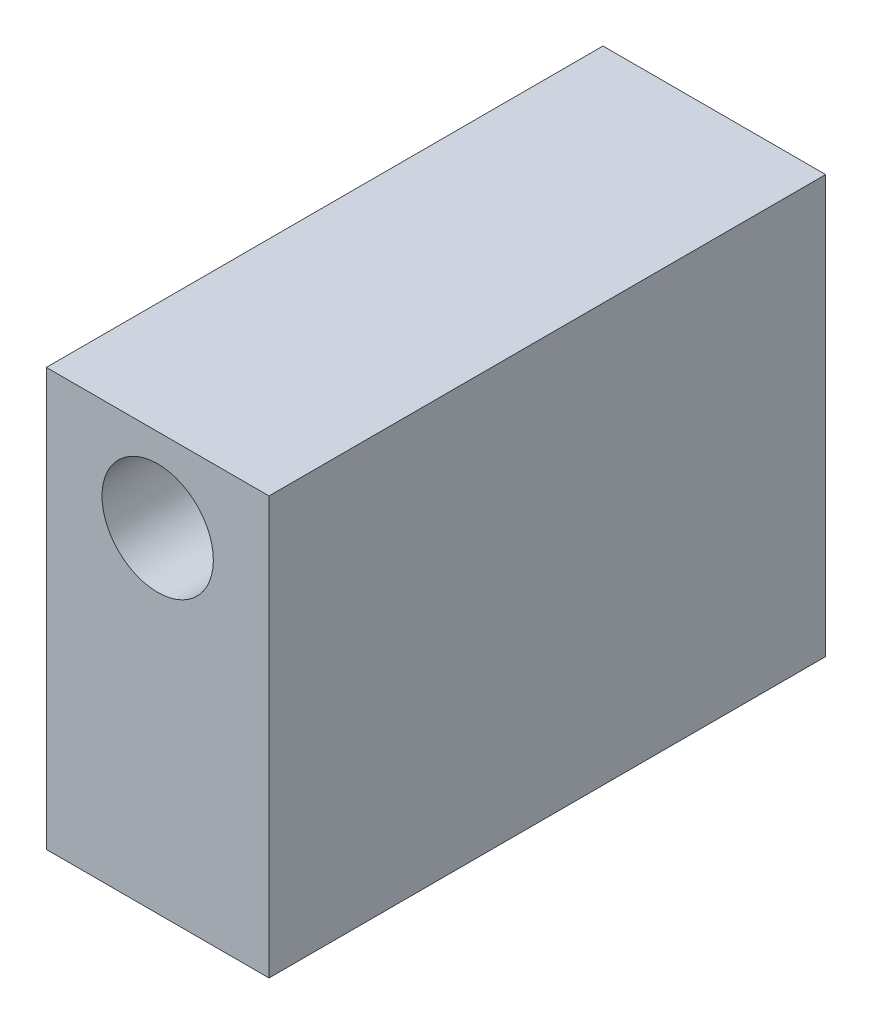
ISO-10303-21;
HEADER;
FILE_DESCRIPTION(('STEP AP214'),'2;1');
FILE_NAME('part.step','',(''),(''),'','','');
FILE_SCHEMA(('AUTOMOTIVE_DESIGN { 1 0 10303 214 1 1 1 1 }'));
ENDSEC;
DATA;
#1=APPLICATION_CONTEXT('core data for automotive mechanical design processes');
#2=APPLICATION_PROTOCOL_DEFINITION('international standard','automotive_design',2000,#1);
#3=PRODUCT_CONTEXT('',#1,'mechanical');
#4=PRODUCT('Part','Part','',(#3));
#5=PRODUCT_RELATED_PRODUCT_CATEGORY('part','',(#4));
#6=PRODUCT_DEFINITION_FORMATION('','',#4);
#7=PRODUCT_DEFINITION_CONTEXT('part definition',#1,'design');
#8=PRODUCT_DEFINITION('design','',#6,#7);
#9=PRODUCT_DEFINITION_SHAPE('','',#8);
#10=(LENGTH_UNIT() NAMED_UNIT(*) SI_UNIT(.MILLI.,.METRE.));
#11=(NAMED_UNIT(*) PLANE_ANGLE_UNIT() SI_UNIT($,.RADIAN.));
#12=(NAMED_UNIT(*) SI_UNIT($,.STERADIAN.) SOLID_ANGLE_UNIT());
#13=UNCERTAINTY_MEASURE_WITH_UNIT(LENGTH_MEASURE(1.E-05),#10,'distance_accuracy_value','');
#14=(GEOMETRIC_REPRESENTATION_CONTEXT(3) GLOBAL_UNCERTAINTY_ASSIGNED_CONTEXT((#13)) GLOBAL_UNIT_ASSIGNED_CONTEXT((#10,
#11,#12)) REPRESENTATION_CONTEXT('',''));
#15=CARTESIAN_POINT('',(0.,0.,0.));
#16=DIRECTION('',(0.,0.,1.));
#17=DIRECTION('',(1.,0.,0.));
#18=AXIS2_PLACEMENT_3D('',#15,#16,#17);
#19=CARTESIAN_POINT('',(20.,75.,-50.));
#20=DIRECTION('',(-1.,0.,0.));
#21=DIRECTION('',(0.,0.,1.));
#22=AXIS2_PLACEMENT_3D('',#19,#20,#21);
#23=PLANE('',#22);
#24=DIRECTION('',(0.,0.,-1.));
#25=VECTOR('',#24,1.);
#26=CARTESIAN_POINT('',(20.,0.,-50.));
#27=LINE('',#26,#25);
#28=CARTESIAN_POINT('',(20.,0.,50.));
#29=VERTEX_POINT('',#28);
#30=CARTESIAN_POINT('',(20.,0.,-50.));
#31=VERTEX_POINT('',#30);
#32=EDGE_CURVE('E99',#29,#31,#27,.T.);
#33=ORIENTED_EDGE('',*,*,#32,.T.);
#34=DIRECTION('',(0.,-1.,0.));
#35=VECTOR('',#34,1.);
#36=CARTESIAN_POINT('',(20.,75.,-50.));
#37=LINE('',#36,#35);
#38=CARTESIAN_POINT('',(20.,75.,-50.));
#39=VERTEX_POINT('',#38);
#40=EDGE_CURVE('E11',#39,#31,#37,.T.);
#41=ORIENTED_EDGE('',*,*,#40,.F.);
#42=DIRECTION('',(0.,0.,-1.));
#43=VECTOR('',#42,1.);
#44=CARTESIAN_POINT('',(20.,75.,-50.));
#45=LINE('',#44,#43);
#46=CARTESIAN_POINT('',(20.,75.,50.));
#47=VERTEX_POINT('',#46);
#48=EDGE_CURVE('E87',#47,#39,#45,.T.);
#49=ORIENTED_EDGE('',*,*,#48,.F.);
#50=DIRECTION('',(0.,-1.,0.));
#51=VECTOR('',#50,1.);
#52=CARTESIAN_POINT('',(20.,75.,50.));
#53=LINE('',#52,#51);
#54=EDGE_CURVE('E95',#47,#29,#53,.T.);
#55=ORIENTED_EDGE('',*,*,#54,.T.);
#56=EDGE_LOOP('',(#33,#41,#49,#55));
#57=FACE_BOUND('',#56,.T.);
#58=ADVANCED_FACE('F36',(#57),#23,.F.);
#59=CARTESIAN_POINT('',(-20.,75.,-50.));
#60=DIRECTION('',(0.,0.,1.));
#61=DIRECTION('',(1.,0.,0.));
#62=AXIS2_PLACEMENT_3D('',#59,#60,#61);
#63=PLANE('',#62);
#64=CARTESIAN_POINT('',(0.,60.,-50.));
#65=DIRECTION('',(0.,0.,1.));
#66=DIRECTION('',(1.,0.,0.));
#67=AXIS2_PLACEMENT_3D('',#64,#65,#66);
#68=CIRCLE('',#67,10.);
#69=CARTESIAN_POINT('',(10.,60.,-50.));
#70=VERTEX_POINT('',#69);
#71=EDGE_CURVE('E115',#70,#70,#68,.T.);
#72=ORIENTED_EDGE('',*,*,#71,.T.);
#73=EDGE_LOOP('',(#72));
#74=FACE_BOUND('',#73,.T.);
#75=DIRECTION('',(-1.,0.,0.));
#76=VECTOR('',#75,1.);
#77=CARTESIAN_POINT('',(-20.,0.,-50.));
#78=LINE('',#77,#76);
#79=CARTESIAN_POINT('',(-20.,0.,-50.));
#80=VERTEX_POINT('',#79);
#81=EDGE_CURVE('E91',#31,#80,#78,.T.);
#82=ORIENTED_EDGE('',*,*,#81,.T.);
#83=DIRECTION('',(0.,-1.,0.));
#84=VECTOR('',#83,1.);
#85=CARTESIAN_POINT('',(-20.,75.,-50.));
#86=LINE('',#85,#84);
#87=CARTESIAN_POINT('',(-20.,75.,-50.));
#88=VERTEX_POINT('',#87);
#89=EDGE_CURVE('E44',#88,#80,#86,.T.);
#90=ORIENTED_EDGE('',*,*,#89,.F.);
#91=DIRECTION('',(-1.,0.,0.));
#92=VECTOR('',#91,1.);
#93=CARTESIAN_POINT('',(-20.,75.,-50.));
#94=LINE('',#93,#92);
#95=EDGE_CURVE('E82',#39,#88,#94,.T.);
#96=ORIENTED_EDGE('',*,*,#95,.F.);
#97=ORIENTED_EDGE('',*,*,#40,.T.);
#98=EDGE_LOOP('',(#82,#90,#96,#97));
#99=FACE_BOUND('',#98,.T.);
#100=ADVANCED_FACE('F90',(#74,#99),#63,.F.);
#101=CARTESIAN_POINT('',(-20.,75.,-50.));
#102=DIRECTION('',(1.,0.,0.));
#103=DIRECTION('',(0.,0.,-1.));
#104=AXIS2_PLACEMENT_3D('',#101,#102,#103);
#105=PLANE('',#104);
#106=DIRECTION('',(0.,0.,1.));
#107=VECTOR('',#106,1.);
#108=CARTESIAN_POINT('',(-20.,0.,-50.));
#109=LINE('',#108,#107);
#110=CARTESIAN_POINT('',(-20.,0.,50.));
#111=VERTEX_POINT('',#110);
#112=EDGE_CURVE('E69',#80,#111,#109,.T.);
#113=ORIENTED_EDGE('',*,*,#112,.T.);
#114=DIRECTION('',(0.,-1.,0.));
#115=VECTOR('',#114,1.);
#116=CARTESIAN_POINT('',(-20.,75.,50.));
#117=LINE('',#116,#115);
#118=CARTESIAN_POINT('',(-20.,75.,50.));
#119=VERTEX_POINT('',#118);
#120=EDGE_CURVE('E92',#119,#111,#117,.T.);
#121=ORIENTED_EDGE('',*,*,#120,.F.);
#122=DIRECTION('',(0.,0.,1.));
#123=VECTOR('',#122,1.);
#124=CARTESIAN_POINT('',(-20.,75.,-50.));
#125=LINE('',#124,#123);
#126=EDGE_CURVE('E85',#88,#119,#125,.T.);
#127=ORIENTED_EDGE('',*,*,#126,.F.);
#128=ORIENTED_EDGE('',*,*,#89,.T.);
#129=EDGE_LOOP('',(#113,#121,#127,#128));
#130=FACE_BOUND('',#129,.T.);
#131=ADVANCED_FACE('F93',(#130),#105,.F.);
#132=CARTESIAN_POINT('',(-20.,75.,50.));
#133=DIRECTION('',(0.,0.,-1.));
#134=DIRECTION('',(-1.,0.,0.));
#135=AXIS2_PLACEMENT_3D('',#132,#133,#134);
#136=PLANE('',#135);
#137=CARTESIAN_POINT('',(0.,60.,50.));
#138=DIRECTION('',(0.,0.,1.));
#139=DIRECTION('',(1.,0.,0.));
#140=AXIS2_PLACEMENT_3D('',#137,#138,#139);
#141=CIRCLE('',#140,10.);
#142=CARTESIAN_POINT('',(10.,60.,50.));
#143=VERTEX_POINT('',#142);
#144=EDGE_CURVE('E102',#143,#143,#141,.T.);
#145=ORIENTED_EDGE('',*,*,#144,.F.);
#146=EDGE_LOOP('',(#145));
#147=FACE_BOUND('',#146,.T.);
#148=DIRECTION('',(1.,0.,0.));
#149=VECTOR('',#148,1.);
#150=CARTESIAN_POINT('',(-20.,0.,50.));
#151=LINE('',#150,#149);
#152=EDGE_CURVE('E75',#111,#29,#151,.T.);
#153=ORIENTED_EDGE('',*,*,#152,.T.);
#154=ORIENTED_EDGE('',*,*,#54,.F.);
#155=DIRECTION('',(1.,0.,0.));
#156=VECTOR('',#155,1.);
#157=CARTESIAN_POINT('',(-20.,75.,50.));
#158=LINE('',#157,#156);
#159=EDGE_CURVE('E52',#119,#47,#158,.T.);
#160=ORIENTED_EDGE('',*,*,#159,.F.);
#161=ORIENTED_EDGE('',*,*,#120,.T.);
#162=EDGE_LOOP('',(#153,#154,#160,#161));
#163=FACE_BOUND('',#162,.T.);
#164=ADVANCED_FACE('F107',(#147,#163),#136,.F.);
#165=CARTESIAN_POINT('',(0.,75.,0.));
#166=DIRECTION('',(0.,1.,0.));
#167=DIRECTION('',(0.,0.,1.));
#168=AXIS2_PLACEMENT_3D('',#165,#166,#167);
#169=PLANE('',#168);
#170=ORIENTED_EDGE('',*,*,#48,.T.);
#171=ORIENTED_EDGE('',*,*,#95,.T.);
#172=ORIENTED_EDGE('',*,*,#126,.T.);
#173=ORIENTED_EDGE('',*,*,#159,.T.);
#174=EDGE_LOOP('',(#170,#171,#172,#173));
#175=FACE_BOUND('',#174,.T.);
#176=ADVANCED_FACE('F83',(#175),#169,.T.);
#177=CARTESIAN_POINT('',(0.,0.,0.));
#178=DIRECTION('',(0.,1.,0.));
#179=DIRECTION('',(0.,0.,1.));
#180=AXIS2_PLACEMENT_3D('',#177,#178,#179);
#181=PLANE('',#180);
#182=ORIENTED_EDGE('',*,*,#32,.F.);
#183=ORIENTED_EDGE('',*,*,#152,.F.);
#184=ORIENTED_EDGE('',*,*,#112,.F.);
#185=ORIENTED_EDGE('',*,*,#81,.F.);
#186=EDGE_LOOP('',(#182,#183,#184,#185));
#187=FACE_BOUND('',#186,.T.);
#188=ADVANCED_FACE('F110',(#187),#181,.F.);
#189=CARTESIAN_POINT('',(0.,60.,50.));
#190=DIRECTION('',(0.,0.,-1.));
#191=DIRECTION('',(-1.,0.,0.));
#192=AXIS2_PLACEMENT_3D('',#189,#190,#191);
#193=CYLINDRICAL_SURFACE('',#192,10.);
#194=ORIENTED_EDGE('',*,*,#144,.T.);
#195=EDGE_LOOP('',(#194));
#196=FACE_BOUND('',#195,.T.);
#197=ORIENTED_EDGE('',*,*,#71,.F.);
#198=EDGE_LOOP('',(#197));
#199=FACE_BOUND('',#198,.T.);
#200=ADVANCED_FACE('F120',(#196,#199),#193,.F.);
#201=CLOSED_SHELL('',(#58,#100,#131,#164,#176,#188,#200));
#202=MANIFOLD_SOLID_BREP('B2',#201);
#203=ADVANCED_BREP_SHAPE_REPRESENTATION('',(#18,#202),#14);
#204=SHAPE_DEFINITION_REPRESENTATION(#9,#203);
ENDSEC;
END-ISO-10303-21;
